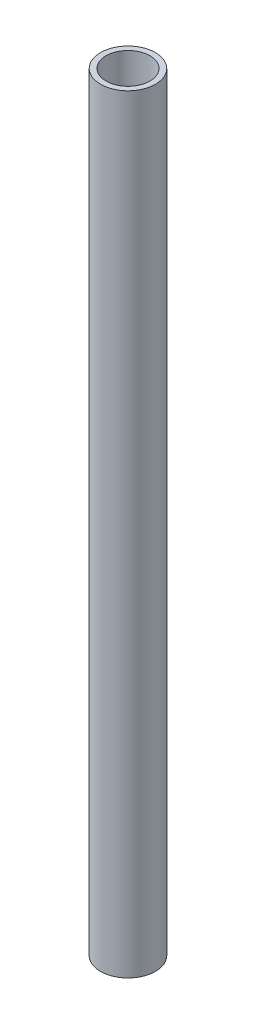
ISO-10303-21;
HEADER;
FILE_DESCRIPTION(('STEP AP214'),'2;1');
FILE_NAME('part.step','',(''),(''),'','','');
FILE_SCHEMA(('AUTOMOTIVE_DESIGN { 1 0 10303 214 1 1 1 1 }'));
ENDSEC;
DATA;
#1=APPLICATION_CONTEXT('core data for automotive mechanical design processes');
#2=APPLICATION_PROTOCOL_DEFINITION('international standard','automotive_design',2000,#1);
#3=PRODUCT_CONTEXT('',#1,'mechanical');
#4=PRODUCT('Part','Part','',(#3));
#5=PRODUCT_RELATED_PRODUCT_CATEGORY('part','',(#4));
#6=PRODUCT_DEFINITION_FORMATION('','',#4);
#7=PRODUCT_DEFINITION_CONTEXT('part definition',#1,'design');
#8=PRODUCT_DEFINITION('design','',#6,#7);
#9=PRODUCT_DEFINITION_SHAPE('','',#8);
#10=(LENGTH_UNIT() NAMED_UNIT(*) SI_UNIT(.MILLI.,.METRE.));
#11=(NAMED_UNIT(*) PLANE_ANGLE_UNIT() SI_UNIT($,.RADIAN.));
#12=(NAMED_UNIT(*) SI_UNIT($,.STERADIAN.) SOLID_ANGLE_UNIT());
#13=UNCERTAINTY_MEASURE_WITH_UNIT(LENGTH_MEASURE(1.E-05),#10,'distance_accuracy_value','');
#14=(GEOMETRIC_REPRESENTATION_CONTEXT(3) GLOBAL_UNCERTAINTY_ASSIGNED_CONTEXT((#13)) GLOBAL_UNIT_ASSIGNED_CONTEXT((#10,
#11,#12)) REPRESENTATION_CONTEXT('',''));
#15=CARTESIAN_POINT('',(0.,0.,0.));
#16=DIRECTION('',(0.,0.,1.));
#17=DIRECTION('',(1.,0.,0.));
#18=AXIS2_PLACEMENT_3D('',#15,#16,#17);
#19=CARTESIAN_POINT('',(0.,7.,0.));
#20=DIRECTION('',(0.,1.,0.));
#21=DIRECTION('',(0.,0.,1.));
#22=AXIS2_PLACEMENT_3D('',#19,#20,#21);
#23=PLANE('',#22);
#24=CARTESIAN_POINT('',(0.,7.,0.));
#25=DIRECTION('',(0.,1.,0.));
#26=DIRECTION('',(0.,0.,1.));
#27=AXIS2_PLACEMENT_3D('',#24,#25,#26);
#28=CIRCLE('',#27,0.25);
#29=CARTESIAN_POINT('',(0.,7.,0.25));
#30=VERTEX_POINT('',#29);
#31=EDGE_CURVE('E10',#30,#30,#28,.T.);
#32=ORIENTED_EDGE('',*,*,#31,.T.);
#33=EDGE_LOOP('',(#32));
#34=FACE_BOUND('',#33,.T.);
#35=CARTESIAN_POINT('',(0.,7.,0.));
#36=DIRECTION('',(0.,1.,0.));
#37=DIRECTION('',(0.,0.,1.));
#38=AXIS2_PLACEMENT_3D('',#35,#36,#37);
#39=CIRCLE('',#38,0.2);
#40=CARTESIAN_POINT('',(0.,7.,0.2));
#41=VERTEX_POINT('',#40);
#42=EDGE_CURVE('E42',#41,#41,#39,.T.);
#43=ORIENTED_EDGE('',*,*,#42,.F.);
#44=EDGE_LOOP('',(#43));
#45=FACE_BOUND('',#44,.T.);
#46=ADVANCED_FACE('F31',(#34,#45),#23,.T.);
#47=CARTESIAN_POINT('',(0.,0.,0.));
#48=DIRECTION('',(0.,1.,0.));
#49=DIRECTION('',(0.,0.,1.));
#50=AXIS2_PLACEMENT_3D('',#47,#48,#49);
#51=PLANE('',#50);
#52=CARTESIAN_POINT('',(0.,0.,0.));
#53=DIRECTION('',(0.,1.,0.));
#54=DIRECTION('',(0.,0.,1.));
#55=AXIS2_PLACEMENT_3D('',#52,#53,#54);
#56=CIRCLE('',#55,0.25);
#57=CARTESIAN_POINT('',(0.,0.,0.25));
#58=VERTEX_POINT('',#57);
#59=EDGE_CURVE('E35',#58,#58,#56,.T.);
#60=ORIENTED_EDGE('',*,*,#59,.F.);
#61=EDGE_LOOP('',(#60));
#62=FACE_BOUND('',#61,.T.);
#63=CARTESIAN_POINT('',(0.,0.,0.));
#64=DIRECTION('',(0.,1.,0.));
#65=DIRECTION('',(0.,0.,1.));
#66=AXIS2_PLACEMENT_3D('',#63,#64,#65);
#67=CIRCLE('',#66,0.2);
#68=CARTESIAN_POINT('',(0.,0.,0.2));
#69=VERTEX_POINT('',#68);
#70=EDGE_CURVE('E44',#69,#69,#67,.T.);
#71=ORIENTED_EDGE('',*,*,#70,.T.);
#72=EDGE_LOOP('',(#71));
#73=FACE_BOUND('',#72,.T.);
#74=ADVANCED_FACE('F54',(#62,#73),#51,.F.);
#75=CARTESIAN_POINT('',(0.,7.,0.));
#76=DIRECTION('',(0.,-1.,0.));
#77=DIRECTION('',(0.,0.,-1.));
#78=AXIS2_PLACEMENT_3D('',#75,#76,#77);
#79=CYLINDRICAL_SURFACE('',#78,0.25);
#80=ORIENTED_EDGE('',*,*,#31,.F.);
#81=EDGE_LOOP('',(#80));
#82=FACE_BOUND('',#81,.T.);
#83=ORIENTED_EDGE('',*,*,#59,.T.);
#84=EDGE_LOOP('',(#83));
#85=FACE_BOUND('',#84,.T.);
#86=ADVANCED_FACE('F33',(#82,#85),#79,.T.);
#87=CARTESIAN_POINT('',(0.,7.,0.));
#88=DIRECTION('',(0.,-1.,0.));
#89=DIRECTION('',(0.,0.,-1.));
#90=AXIS2_PLACEMENT_3D('',#87,#88,#89);
#91=CYLINDRICAL_SURFACE('',#90,0.2);
#92=ORIENTED_EDGE('',*,*,#42,.T.);
#93=EDGE_LOOP('',(#92));
#94=FACE_BOUND('',#93,.T.);
#95=ORIENTED_EDGE('',*,*,#70,.F.);
#96=EDGE_LOOP('',(#95));
#97=FACE_BOUND('',#96,.T.);
#98=ADVANCED_FACE('F50',(#94,#97),#91,.F.);
#99=CLOSED_SHELL('',(#46,#74,#86,#98));
#100=MANIFOLD_SOLID_BREP('B2',#99);
#101=ADVANCED_BREP_SHAPE_REPRESENTATION('',(#18,#100),#14);
#102=SHAPE_DEFINITION_REPRESENTATION(#9,#101);
ENDSEC;
END-ISO-10303-21;
